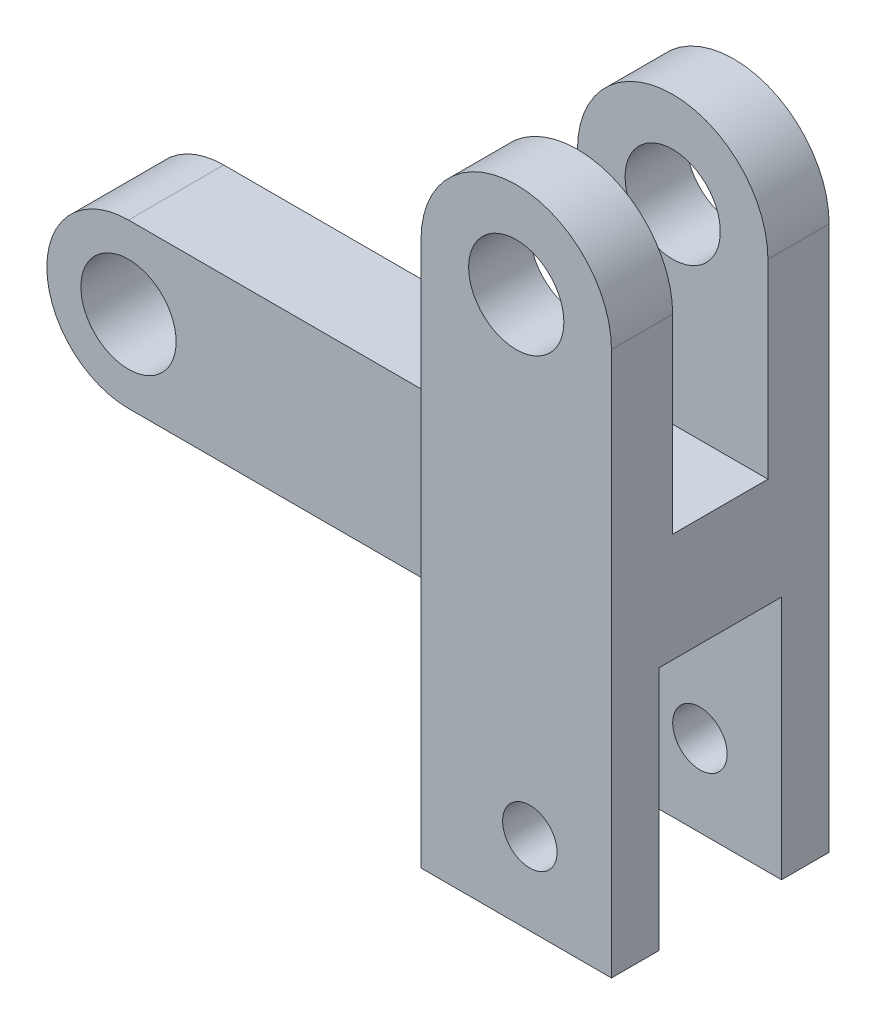
ISO-10303-21;
HEADER;
FILE_DESCRIPTION(('STEP AP214'),'2;1');
FILE_NAME('part.step','',(''),(''),'','','');
FILE_SCHEMA(('AUTOMOTIVE_DESIGN { 1 0 10303 214 1 1 1 1 }'));
ENDSEC;
DATA;
#1=APPLICATION_CONTEXT('core data for automotive mechanical design processes');
#2=APPLICATION_PROTOCOL_DEFINITION('international standard','automotive_design',2000,#1);
#3=PRODUCT_CONTEXT('',#1,'mechanical');
#4=PRODUCT('Part','Part','',(#3));
#5=PRODUCT_RELATED_PRODUCT_CATEGORY('part','',(#4));
#6=PRODUCT_DEFINITION_FORMATION('','',#4);
#7=PRODUCT_DEFINITION_CONTEXT('part definition',#1,'design');
#8=PRODUCT_DEFINITION('design','',#6,#7);
#9=PRODUCT_DEFINITION_SHAPE('','',#8);
#10=(LENGTH_UNIT() NAMED_UNIT(*) SI_UNIT(.MILLI.,.METRE.));
#11=(NAMED_UNIT(*) PLANE_ANGLE_UNIT() SI_UNIT($,.RADIAN.));
#12=(NAMED_UNIT(*) SI_UNIT($,.STERADIAN.) SOLID_ANGLE_UNIT());
#13=UNCERTAINTY_MEASURE_WITH_UNIT(LENGTH_MEASURE(1.E-05),#10,'distance_accuracy_value','');
#14=(GEOMETRIC_REPRESENTATION_CONTEXT(3) GLOBAL_UNCERTAINTY_ASSIGNED_CONTEXT((#13)) GLOBAL_UNIT_ASSIGNED_CONTEXT((#10,
#11,#12)) REPRESENTATION_CONTEXT('',''));
#15=CARTESIAN_POINT('',(0.,0.,0.));
#16=DIRECTION('',(0.,0.,1.));
#17=DIRECTION('',(1.,0.,0.));
#18=AXIS2_PLACEMENT_3D('',#15,#16,#17);
#19=CARTESIAN_POINT('',(0.,2.4,-3.5));
#20=DIRECTION('',(1.,0.,0.));
#21=DIRECTION('',(0.,0.,-1.));
#22=AXIS2_PLACEMENT_3D('',#19,#20,#21);
#23=PLANE('',#22);
#24=DIRECTION('',(0.,-1.,0.));
#25=VECTOR('',#24,1.);
#26=CARTESIAN_POINT('',(0.,-0.999999999999999,2.25));
#27=LINE('',#26,#25);
#28=CARTESIAN_POINT('',(0.,-0.999999999999999,2.25));
#29=VERTEX_POINT('',#28);
#30=CARTESIAN_POINT('',(0.,-10.,2.25));
#31=VERTEX_POINT('',#30);
#32=EDGE_CURVE('E239',#29,#31,#27,.T.);
#33=ORIENTED_EDGE('',*,*,#32,.T.);
#34=DIRECTION('',(0.,0.,-1.));
#35=VECTOR('',#34,1.);
#36=CARTESIAN_POINT('',(0.,-10.,3.5));
#37=LINE('',#36,#35);
#38=CARTESIAN_POINT('',(0.,-10.,4.));
#39=VERTEX_POINT('',#38);
#40=EDGE_CURVE('E278',#39,#31,#37,.T.);
#41=ORIENTED_EDGE('',*,*,#40,.F.);
#42=DIRECTION('',(0.,-1.,0.));
#43=VECTOR('',#42,1.);
#44=CARTESIAN_POINT('',(0.,10.,4.));
#45=LINE('',#44,#43);
#46=CARTESIAN_POINT('',(0.,10.,4.));
#47=VERTEX_POINT('',#46);
#48=EDGE_CURVE('E212',#47,#39,#45,.T.);
#49=ORIENTED_EDGE('',*,*,#48,.F.);
#50=DIRECTION('',(0.,0.,1.));
#51=VECTOR('',#50,1.);
#52=CARTESIAN_POINT('',(0.,10.,1.75));
#53=LINE('',#52,#51);
#54=CARTESIAN_POINT('',(0.,10.,1.75));
#55=VERTEX_POINT('',#54);
#56=EDGE_CURVE('E296',#55,#47,#53,.T.);
#57=ORIENTED_EDGE('',*,*,#56,.F.);
#58=DIRECTION('',(0.,1.,0.));
#59=VECTOR('',#58,1.);
#60=CARTESIAN_POINT('',(0.,0.,1.75));
#61=LINE('',#60,#59);
#62=CARTESIAN_POINT('',(0.,3.,1.75));
#63=VERTEX_POINT('',#62);
#64=EDGE_CURVE('E285',#63,#55,#61,.T.);
#65=ORIENTED_EDGE('',*,*,#64,.F.);
#66=CARTESIAN_POINT('',(0.,-0.999999999999999,1.75));
#67=VERTEX_POINT('',#66);
#68=EDGE_CURVE('E290',#67,#63,#61,.T.);
#69=ORIENTED_EDGE('',*,*,#68,.F.);
#70=DIRECTION('',(0.,0.,1.));
#71=VECTOR('',#70,1.);
#72=CARTESIAN_POINT('',(0.,-0.999999999999999,2.25));
#73=LINE('',#72,#71);
#74=EDGE_CURVE('E221',#67,#29,#73,.T.);
#75=ORIENTED_EDGE('',*,*,#74,.T.);
#76=EDGE_LOOP('',(#33,#41,#49,#57,#65,#69,#75));
#77=FACE_BOUND('',#76,.T.);
#78=ADVANCED_FACE('F45',(#77),#23,.F.);
#79=DIRECTION('',(0.,-1.,0.));
#80=VECTOR('',#79,1.);
#81=CARTESIAN_POINT('',(0.,-0.999999999999999,-2.25));
#82=LINE('',#81,#80);
#83=CARTESIAN_POINT('',(0.,-0.999999999999999,-2.25));
#84=VERTEX_POINT('',#83);
#85=CARTESIAN_POINT('',(0.,-10.,-2.25));
#86=VERTEX_POINT('',#85);
#87=EDGE_CURVE('E228',#84,#86,#82,.T.);
#88=ORIENTED_EDGE('',*,*,#87,.F.);
#89=CARTESIAN_POINT('',(0.,-0.999999999999999,-1.75));
#90=VERTEX_POINT('',#89);
#91=EDGE_CURVE('E216',#84,#90,#73,.T.);
#92=ORIENTED_EDGE('',*,*,#91,.T.);
#93=DIRECTION('',(0.,1.,0.));
#94=VECTOR('',#93,1.);
#95=CARTESIAN_POINT('',(0.,0.,-1.75));
#96=LINE('',#95,#94);
#97=CARTESIAN_POINT('',(0.,3.,-1.75));
#98=VERTEX_POINT('',#97);
#99=EDGE_CURVE('E301',#90,#98,#96,.T.);
#100=ORIENTED_EDGE('',*,*,#99,.T.);
#101=CARTESIAN_POINT('',(0.,10.,-1.75));
#102=VERTEX_POINT('',#101);
#103=EDGE_CURVE('E298',#98,#102,#96,.T.);
#104=ORIENTED_EDGE('',*,*,#103,.T.);
#105=DIRECTION('',(0.,0.,-1.));
#106=VECTOR('',#105,1.);
#107=CARTESIAN_POINT('',(0.,10.,-1.75));
#108=LINE('',#107,#106);
#109=CARTESIAN_POINT('',(0.,10.,-4.));
#110=VERTEX_POINT('',#109);
#111=EDGE_CURVE('E169',#102,#110,#108,.T.);
#112=ORIENTED_EDGE('',*,*,#111,.T.);
#113=DIRECTION('',(0.,1.,0.));
#114=VECTOR('',#113,1.);
#115=CARTESIAN_POINT('',(0.,-10.,-4.));
#116=LINE('',#115,#114);
#117=CARTESIAN_POINT('',(0.,-10.,-4.));
#118=VERTEX_POINT('',#117);
#119=EDGE_CURVE('E187',#118,#110,#116,.T.);
#120=ORIENTED_EDGE('',*,*,#119,.F.);
#121=EDGE_CURVE('E277',#86,#118,#37,.T.);
#122=ORIENTED_EDGE('',*,*,#121,.F.);
#123=EDGE_LOOP('',(#88,#92,#100,#104,#112,#120,#122));
#124=FACE_BOUND('',#123,.T.);
#125=ADVANCED_FACE('F368',(#124),#23,.F.);
#126=CARTESIAN_POINT('',(7.,2.4,-3.5));
#127=DIRECTION('',(-1.,0.,0.));
#128=DIRECTION('',(0.,0.,1.));
#129=AXIS2_PLACEMENT_3D('',#126,#127,#128);
#130=PLANE('',#129);
#131=DIRECTION('',(0.,-1.,0.));
#132=VECTOR('',#131,1.);
#133=CARTESIAN_POINT('',(7.,-0.999999999999999,2.25));
#134=LINE('',#133,#132);
#135=CARTESIAN_POINT('',(7.,-0.999999999999999,2.25));
#136=VERTEX_POINT('',#135);
#137=CARTESIAN_POINT('',(7.,-10.,2.25));
#138=VERTEX_POINT('',#137);
#139=EDGE_CURVE('E237',#136,#138,#134,.T.);
#140=ORIENTED_EDGE('',*,*,#139,.F.);
#141=DIRECTION('',(0.,0.,-1.));
#142=VECTOR('',#141,1.);
#143=CARTESIAN_POINT('',(7.,-0.999999999999999,2.25));
#144=LINE('',#143,#142);
#145=CARTESIAN_POINT('',(7.,-0.999999999999999,-2.25));
#146=VERTEX_POINT('',#145);
#147=EDGE_CURVE('E223',#136,#146,#144,.T.);
#148=ORIENTED_EDGE('',*,*,#147,.T.);
#149=DIRECTION('',(0.,-1.,0.));
#150=VECTOR('',#149,1.);
#151=CARTESIAN_POINT('',(7.,-0.999999999999999,-2.25));
#152=LINE('',#151,#150);
#153=CARTESIAN_POINT('',(7.,-10.,-2.25));
#154=VERTEX_POINT('',#153);
#155=EDGE_CURVE('E235',#146,#154,#152,.T.);
#156=ORIENTED_EDGE('',*,*,#155,.T.);
#157=DIRECTION('',(0.,0.,1.));
#158=VECTOR('',#157,1.);
#159=CARTESIAN_POINT('',(7.,-10.,-3.5));
#160=LINE('',#159,#158);
#161=CARTESIAN_POINT('',(7.,-10.,-4.));
#162=VERTEX_POINT('',#161);
#163=EDGE_CURVE('E177',#162,#154,#160,.T.);
#164=ORIENTED_EDGE('',*,*,#163,.F.);
#165=DIRECTION('',(0.,-1.,0.));
#166=VECTOR('',#165,1.);
#167=CARTESIAN_POINT('',(7.,10.,-4.));
#168=LINE('',#167,#166);
#169=CARTESIAN_POINT('',(7.,10.,-4.));
#170=VERTEX_POINT('',#169);
#171=EDGE_CURVE('E172',#170,#162,#168,.T.);
#172=ORIENTED_EDGE('',*,*,#171,.F.);
#173=DIRECTION('',(0.,0.,-1.));
#174=VECTOR('',#173,1.);
#175=CARTESIAN_POINT('',(7.,10.,-1.75));
#176=LINE('',#175,#174);
#177=CARTESIAN_POINT('',(7.,10.,-1.75));
#178=VERTEX_POINT('',#177);
#179=EDGE_CURVE('E53',#178,#170,#176,.T.);
#180=ORIENTED_EDGE('',*,*,#179,.F.);
#181=DIRECTION('',(0.,-1.,0.));
#182=VECTOR('',#181,1.);
#183=CARTESIAN_POINT('',(7.,0.,-1.75));
#184=LINE('',#183,#182);
#185=CARTESIAN_POINT('',(7.,3.,-1.75));
#186=VERTEX_POINT('',#185);
#187=EDGE_CURVE('E303',#178,#186,#184,.T.);
#188=ORIENTED_EDGE('',*,*,#187,.T.);
#189=DIRECTION('',(0.,0.,-1.));
#190=VECTOR('',#189,1.);
#191=CARTESIAN_POINT('',(7.,3.,1.75));
#192=LINE('',#191,#190);
#193=CARTESIAN_POINT('',(7.,3.,1.75));
#194=VERTEX_POINT('',#193);
#195=EDGE_CURVE('E269',#194,#186,#192,.T.);
#196=ORIENTED_EDGE('',*,*,#195,.F.);
#197=DIRECTION('',(0.,-1.,0.));
#198=VECTOR('',#197,1.);
#199=CARTESIAN_POINT('',(7.,0.,1.75));
#200=LINE('',#199,#198);
#201=CARTESIAN_POINT('',(7.,10.,1.75));
#202=VERTEX_POINT('',#201);
#203=EDGE_CURVE('E292',#202,#194,#200,.T.);
#204=ORIENTED_EDGE('',*,*,#203,.F.);
#205=DIRECTION('',(0.,0.,1.));
#206=VECTOR('',#205,1.);
#207=CARTESIAN_POINT('',(7.,10.,1.75));
#208=LINE('',#207,#206);
#209=CARTESIAN_POINT('',(7.,10.,4.));
#210=VERTEX_POINT('',#209);
#211=EDGE_CURVE('E294',#202,#210,#208,.T.);
#212=ORIENTED_EDGE('',*,*,#211,.T.);
#213=DIRECTION('',(0.,1.,0.));
#214=VECTOR('',#213,1.);
#215=CARTESIAN_POINT('',(7.,-10.,4.));
#216=LINE('',#215,#214);
#217=CARTESIAN_POINT('',(7.,-10.,4.));
#218=VERTEX_POINT('',#217);
#219=EDGE_CURVE('E206',#218,#210,#216,.T.);
#220=ORIENTED_EDGE('',*,*,#219,.F.);
#221=EDGE_CURVE('E275',#138,#218,#160,.T.);
#222=ORIENTED_EDGE('',*,*,#221,.F.);
#223=EDGE_LOOP('',(#140,#148,#156,#164,#172,#180,#188,#196,#204,#212,#220,#222));
#224=FACE_BOUND('',#223,.T.);
#225=ADVANCED_FACE('F174',(#224),#130,.F.);
#226=CARTESIAN_POINT('',(0.,-10.,0.));
#227=DIRECTION('',(0.,-1.,0.));
#228=DIRECTION('',(0.,0.,-1.));
#229=AXIS2_PLACEMENT_3D('',#226,#227,#228);
#230=PLANE('',#229);
#231=ORIENTED_EDGE('',*,*,#40,.T.);
#232=DIRECTION('',(1.,0.,0.));
#233=VECTOR('',#232,1.);
#234=CARTESIAN_POINT('',(0.,-10.,2.25));
#235=LINE('',#234,#233);
#236=EDGE_CURVE('E215',#31,#138,#235,.T.);
#237=ORIENTED_EDGE('',*,*,#236,.T.);
#238=ORIENTED_EDGE('',*,*,#221,.T.);
#239=DIRECTION('',(1.,0.,0.));
#240=VECTOR('',#239,1.);
#241=CARTESIAN_POINT('',(0.,-10.,4.));
#242=LINE('',#241,#240);
#243=EDGE_CURVE('E203',#39,#218,#242,.T.);
#244=ORIENTED_EDGE('',*,*,#243,.F.);
#245=EDGE_LOOP('',(#231,#237,#238,#244));
#246=FACE_BOUND('',#245,.T.);
#247=ADVANCED_FACE('F330',(#246),#230,.T.);
#248=ORIENTED_EDGE('',*,*,#163,.T.);
#249=DIRECTION('',(-1.,0.,0.));
#250=VECTOR('',#249,1.);
#251=CARTESIAN_POINT('',(0.,-10.,-2.25));
#252=LINE('',#251,#250);
#253=EDGE_CURVE('E231',#154,#86,#252,.T.);
#254=ORIENTED_EDGE('',*,*,#253,.T.);
#255=ORIENTED_EDGE('',*,*,#121,.T.);
#256=DIRECTION('',(-1.,0.,0.));
#257=VECTOR('',#256,1.);
#258=CARTESIAN_POINT('',(7.,-10.,-4.));
#259=LINE('',#258,#257);
#260=EDGE_CURVE('E181',#162,#118,#259,.T.);
#261=ORIENTED_EDGE('',*,*,#260,.F.);
#262=EDGE_LOOP('',(#248,#254,#255,#261));
#263=FACE_BOUND('',#262,.T.);
#264=ADVANCED_FACE('F379',(#263),#230,.T.);
#265=CARTESIAN_POINT('',(4.,-7.,-3.5));
#266=DIRECTION('',(0.,0.,1.));
#267=DIRECTION('',(1.,0.,0.));
#268=AXIS2_PLACEMENT_3D('',#265,#266,#267);
#269=CYLINDRICAL_SURFACE('',#268,1.);
#270=CARTESIAN_POINT('',(4.,-7.,2.25));
#271=DIRECTION('',(0.,0.,-1.));
#272=DIRECTION('',(-1.,0.,0.));
#273=AXIS2_PLACEMENT_3D('',#270,#271,#272);
#274=CIRCLE('',#273,1.);
#275=CARTESIAN_POINT('',(3.,-7.,2.25));
#276=VERTEX_POINT('',#275);
#277=EDGE_CURVE('E48',#276,#276,#274,.T.);
#278=ORIENTED_EDGE('',*,*,#277,.T.);
#279=EDGE_LOOP('',(#278));
#280=FACE_BOUND('',#279,.T.);
#281=CARTESIAN_POINT('',(4.,-7.,4.));
#282=DIRECTION('',(0.,0.,1.));
#283=DIRECTION('',(1.,0.,0.));
#284=AXIS2_PLACEMENT_3D('',#281,#282,#283);
#285=CIRCLE('',#284,1.);
#286=CARTESIAN_POINT('',(5.,-7.,4.));
#287=VERTEX_POINT('',#286);
#288=EDGE_CURVE('E200',#287,#287,#285,.T.);
#289=ORIENTED_EDGE('',*,*,#288,.T.);
#290=EDGE_LOOP('',(#289));
#291=FACE_BOUND('',#290,.T.);
#292=ADVANCED_FACE('F313',(#280,#291),#269,.F.);
#293=CARTESIAN_POINT('',(4.,-7.,-2.25));
#294=DIRECTION('',(0.,0.,1.));
#295=DIRECTION('',(1.,0.,0.));
#296=AXIS2_PLACEMENT_3D('',#293,#294,#295);
#297=CIRCLE('',#296,1.);
#298=CARTESIAN_POINT('',(5.,-7.,-2.25));
#299=VERTEX_POINT('',#298);
#300=EDGE_CURVE('E242',#299,#299,#297,.T.);
#301=ORIENTED_EDGE('',*,*,#300,.T.);
#302=EDGE_LOOP('',(#301));
#303=FACE_BOUND('',#302,.T.);
#304=CARTESIAN_POINT('',(4.,-7.,-4.));
#305=DIRECTION('',(0.,0.,-1.));
#306=DIRECTION('',(-1.,0.,0.));
#307=AXIS2_PLACEMENT_3D('',#304,#305,#306);
#308=CIRCLE('',#307,0.999999999999997);
#309=CARTESIAN_POINT('',(3.,-7.,-4.));
#310=VERTEX_POINT('',#309);
#311=EDGE_CURVE('E188',#310,#310,#308,.T.);
#312=ORIENTED_EDGE('',*,*,#311,.T.);
#313=EDGE_LOOP('',(#312));
#314=FACE_BOUND('',#313,.T.);
#315=ADVANCED_FACE('F387',(#303,#314),#269,.F.);
#316=CARTESIAN_POINT('',(3.5,10.,-1.75));
#317=DIRECTION('',(0.,0.,-1.));
#318=DIRECTION('',(-1.,0.,0.));
#319=AXIS2_PLACEMENT_3D('',#316,#317,#318);
#320=CYLINDRICAL_SURFACE('',#319,3.5);
#321=ORIENTED_EDGE('',*,*,#179,.T.);
#322=CARTESIAN_POINT('',(3.5,10.,-4.));
#323=DIRECTION('',(0.,0.,-1.));
#324=DIRECTION('',(-1.,0.,0.));
#325=AXIS2_PLACEMENT_3D('',#322,#323,#324);
#326=CIRCLE('',#325,3.5);
#327=EDGE_CURVE('E165',#110,#170,#326,.T.);
#328=ORIENTED_EDGE('',*,*,#327,.F.);
#329=ORIENTED_EDGE('',*,*,#111,.F.);
#330=CARTESIAN_POINT('',(3.5,10.,-1.75));
#331=DIRECTION('',(0.,0.,-1.));
#332=DIRECTION('',(-1.,0.,0.));
#333=AXIS2_PLACEMENT_3D('',#330,#331,#332);
#334=CIRCLE('',#333,3.5);
#335=EDGE_CURVE('E167',#102,#178,#334,.T.);
#336=ORIENTED_EDGE('',*,*,#335,.T.);
#337=EDGE_LOOP('',(#321,#328,#329,#336));
#338=FACE_BOUND('',#337,.T.);
#339=ADVANCED_FACE('F162',(#338),#320,.T.);
#340=CARTESIAN_POINT('',(0.,0.,-1.75));
#341=DIRECTION('',(0.,0.,-1.));
#342=DIRECTION('',(-1.,0.,0.));
#343=AXIS2_PLACEMENT_3D('',#340,#341,#342);
#344=PLANE('',#343);
#345=CARTESIAN_POINT('',(3.5,10.,-1.75));
#346=DIRECTION('',(0.,0.,-1.));
#347=DIRECTION('',(-1.,0.,0.));
#348=AXIS2_PLACEMENT_3D('',#345,#346,#347);
#349=CIRCLE('',#348,1.75);
#350=CARTESIAN_POINT('',(1.75,10.,-1.75));
#351=VERTEX_POINT('',#350);
#352=EDGE_CURVE('E282',#351,#351,#349,.T.);
#353=ORIENTED_EDGE('',*,*,#352,.T.);
#354=EDGE_LOOP('',(#353));
#355=FACE_BOUND('',#354,.T.);
#356=ORIENTED_EDGE('',*,*,#103,.F.);
#357=DIRECTION('',(1.,0.,0.));
#358=VECTOR('',#357,1.);
#359=CARTESIAN_POINT('',(0.,3.,-1.75));
#360=LINE('',#359,#358);
#361=EDGE_CURVE('E69',#98,#186,#360,.T.);
#362=ORIENTED_EDGE('',*,*,#361,.T.);
#363=ORIENTED_EDGE('',*,*,#187,.F.);
#364=ORIENTED_EDGE('',*,*,#335,.F.);
#365=EDGE_LOOP('',(#356,#362,#363,#364));
#366=FACE_BOUND('',#365,.T.);
#367=ADVANCED_FACE('F369',(#355,#366),#344,.F.);
#368=CARTESIAN_POINT('',(3.5,10.,1.75));
#369=DIRECTION('',(0.,0.,1.));
#370=DIRECTION('',(1.,0.,0.));
#371=AXIS2_PLACEMENT_3D('',#368,#369,#370);
#372=CYLINDRICAL_SURFACE('',#371,3.5);
#373=ORIENTED_EDGE('',*,*,#56,.T.);
#374=CARTESIAN_POINT('',(3.5,10.,4.));
#375=DIRECTION('',(0.,0.,1.));
#376=DIRECTION('',(1.,0.,0.));
#377=AXIS2_PLACEMENT_3D('',#374,#375,#376);
#378=CIRCLE('',#377,3.5);
#379=EDGE_CURVE('E209',#210,#47,#378,.T.);
#380=ORIENTED_EDGE('',*,*,#379,.F.);
#381=ORIENTED_EDGE('',*,*,#211,.F.);
#382=CARTESIAN_POINT('',(3.5,10.,1.75));
#383=DIRECTION('',(0.,0.,-1.));
#384=DIRECTION('',(-1.,0.,0.));
#385=AXIS2_PLACEMENT_3D('',#382,#383,#384);
#386=CIRCLE('',#385,3.5);
#387=EDGE_CURVE('E289',#55,#202,#386,.T.);
#388=ORIENTED_EDGE('',*,*,#387,.F.);
#389=EDGE_LOOP('',(#373,#380,#381,#388));
#390=FACE_BOUND('',#389,.T.);
#391=ADVANCED_FACE('F340',(#390),#372,.T.);
#392=CARTESIAN_POINT('',(0.,0.,1.75));
#393=DIRECTION('',(0.,0.,-1.));
#394=DIRECTION('',(-1.,0.,0.));
#395=AXIS2_PLACEMENT_3D('',#392,#393,#394);
#396=PLANE('',#395);
#397=DIRECTION('',(1.,0.,0.));
#398=VECTOR('',#397,1.);
#399=CARTESIAN_POINT('',(0.,3.,1.75));
#400=LINE('',#399,#398);
#401=EDGE_CURVE('E12',#63,#194,#400,.T.);
#402=ORIENTED_EDGE('',*,*,#401,.F.);
#403=ORIENTED_EDGE('',*,*,#64,.T.);
#404=ORIENTED_EDGE('',*,*,#387,.T.);
#405=ORIENTED_EDGE('',*,*,#203,.T.);
#406=EDGE_LOOP('',(#402,#403,#404,#405));
#407=FACE_BOUND('',#406,.T.);
#408=CARTESIAN_POINT('',(3.5,10.,1.75));
#409=DIRECTION('',(0.,0.,-1.));
#410=DIRECTION('',(-1.,0.,0.));
#411=AXIS2_PLACEMENT_3D('',#408,#409,#410);
#412=CIRCLE('',#411,1.75);
#413=CARTESIAN_POINT('',(1.75,10.,1.75));
#414=VERTEX_POINT('',#413);
#415=EDGE_CURVE('E281',#414,#414,#412,.T.);
#416=ORIENTED_EDGE('',*,*,#415,.F.);
#417=EDGE_LOOP('',(#416));
#418=FACE_BOUND('',#417,.T.);
#419=ADVANCED_FACE('F345',(#407,#418),#396,.T.);
#420=CARTESIAN_POINT('',(3.5,10.,3.5));
#421=DIRECTION('',(0.,0.,-1.));
#422=DIRECTION('',(-1.,0.,0.));
#423=AXIS2_PLACEMENT_3D('',#420,#421,#422);
#424=CYLINDRICAL_SURFACE('',#423,1.75);
#425=ORIENTED_EDGE('',*,*,#415,.T.);
#426=EDGE_LOOP('',(#425));
#427=FACE_BOUND('',#426,.T.);
#428=CARTESIAN_POINT('',(3.5,10.,4.));
#429=DIRECTION('',(0.,0.,1.));
#430=DIRECTION('',(1.,0.,0.));
#431=AXIS2_PLACEMENT_3D('',#428,#429,#430);
#432=CIRCLE('',#431,1.75);
#433=CARTESIAN_POINT('',(5.25,10.,4.));
#434=VERTEX_POINT('',#433);
#435=EDGE_CURVE('E197',#434,#434,#432,.T.);
#436=ORIENTED_EDGE('',*,*,#435,.T.);
#437=EDGE_LOOP('',(#436));
#438=FACE_BOUND('',#437,.T.);
#439=ADVANCED_FACE('F411',(#427,#438),#424,.F.);
#440=ORIENTED_EDGE('',*,*,#352,.F.);
#441=EDGE_LOOP('',(#440));
#442=FACE_BOUND('',#441,.T.);
#443=CARTESIAN_POINT('',(3.5,10.,-4.));
#444=DIRECTION('',(0.,0.,-1.));
#445=DIRECTION('',(-1.,0.,0.));
#446=AXIS2_PLACEMENT_3D('',#443,#444,#445);
#447=CIRCLE('',#446,1.75);
#448=CARTESIAN_POINT('',(1.75,10.,-4.));
#449=VERTEX_POINT('',#448);
#450=EDGE_CURVE('E191',#449,#449,#447,.T.);
#451=ORIENTED_EDGE('',*,*,#450,.T.);
#452=EDGE_LOOP('',(#451));
#453=FACE_BOUND('',#452,.T.);
#454=ADVANCED_FACE('F413',(#442,#453),#424,.F.);
#455=CARTESIAN_POINT('',(0.,-3.,1.75));
#456=DIRECTION('',(0.,1.,0.));
#457=DIRECTION('',(-1.,0.,0.));
#458=AXIS2_PLACEMENT_3D('',#455,#456,#457);
#459=PLANE('',#458);
#460=DIRECTION('',(1.,0.,0.));
#461=VECTOR('',#460,1.);
#462=CARTESIAN_POINT('',(0.,-3.,-1.75));
#463=LINE('',#462,#461);
#464=CARTESIAN_POINT('',(-13.,-3.,-1.75));
#465=VERTEX_POINT('',#464);
#466=CARTESIAN_POINT('',(0.,-3.,-1.75));
#467=VERTEX_POINT('',#466);
#468=EDGE_CURVE('E263',#465,#467,#463,.T.);
#469=ORIENTED_EDGE('',*,*,#468,.T.);
#470=DIRECTION('',(0.,0.,1.));
#471=VECTOR('',#470,1.);
#472=CARTESIAN_POINT('',(0.,-3.,-3.5));
#473=LINE('',#472,#471);
#474=CARTESIAN_POINT('',(0.,-3.,1.75));
#475=VERTEX_POINT('',#474);
#476=EDGE_CURVE('E61',#467,#475,#473,.T.);
#477=ORIENTED_EDGE('',*,*,#476,.T.);
#478=DIRECTION('',(1.,0.,0.));
#479=VECTOR('',#478,1.);
#480=CARTESIAN_POINT('',(0.,-3.,1.75));
#481=LINE('',#480,#479);
#482=CARTESIAN_POINT('',(-13.,-3.,1.75));
#483=VERTEX_POINT('',#482);
#484=EDGE_CURVE('E250',#483,#475,#481,.T.);
#485=ORIENTED_EDGE('',*,*,#484,.F.);
#486=DIRECTION('',(0.,0.,-1.));
#487=VECTOR('',#486,1.);
#488=CARTESIAN_POINT('',(-13.,-3.,1.75));
#489=LINE('',#488,#487);
#490=EDGE_CURVE('E272',#483,#465,#489,.T.);
#491=ORIENTED_EDGE('',*,*,#490,.T.);
#492=EDGE_LOOP('',(#469,#477,#485,#491));
#493=FACE_BOUND('',#492,.T.);
#494=ADVANCED_FACE('F355',(#493),#459,.F.);
#495=CARTESIAN_POINT('',(0.,0.,1.75));
#496=DIRECTION('',(0.,0.,1.));
#497=DIRECTION('',(1.,0.,0.));
#498=AXIS2_PLACEMENT_3D('',#495,#496,#497);
#499=PLANE('',#498);
#500=CARTESIAN_POINT('',(-13.,0.,1.75));
#501=DIRECTION('',(0.,0.,1.));
#502=DIRECTION('',(1.,0.,0.));
#503=AXIS2_PLACEMENT_3D('',#500,#501,#502);
#504=CIRCLE('',#503,1.75);
#505=CARTESIAN_POINT('',(-11.25,0.,1.75));
#506=VERTEX_POINT('',#505);
#507=EDGE_CURVE('E243',#506,#506,#504,.T.);
#508=ORIENTED_EDGE('',*,*,#507,.F.);
#509=EDGE_LOOP('',(#508));
#510=FACE_BOUND('',#509,.T.);
#511=EDGE_CURVE('E286',#475,#67,#61,.T.);
#512=ORIENTED_EDGE('',*,*,#511,.T.);
#513=ORIENTED_EDGE('',*,*,#68,.T.);
#514=DIRECTION('',(1.,0.,0.));
#515=VECTOR('',#514,1.);
#516=CARTESIAN_POINT('',(0.,3.,1.75));
#517=LINE('',#516,#515);
#518=CARTESIAN_POINT('',(-13.,3.,1.75));
#519=VERTEX_POINT('',#518);
#520=EDGE_CURVE('E253',#519,#63,#517,.T.);
#521=ORIENTED_EDGE('',*,*,#520,.F.);
#522=CARTESIAN_POINT('',(-13.,0.,1.75));
#523=DIRECTION('',(0.,0.,1.));
#524=DIRECTION('',(1.,0.,0.));
#525=AXIS2_PLACEMENT_3D('',#522,#523,#524);
#526=CIRCLE('',#525,3.);
#527=EDGE_CURVE('E246',#483,#519,#526,.F.);
#528=ORIENTED_EDGE('',*,*,#527,.F.);
#529=ORIENTED_EDGE('',*,*,#484,.T.);
#530=EDGE_LOOP('',(#512,#513,#521,#528,#529));
#531=FACE_BOUND('',#530,.T.);
#532=ADVANCED_FACE('F349',(#510,#531),#499,.T.);
#533=CARTESIAN_POINT('',(0.,0.,-1.75));
#534=DIRECTION('',(0.,0.,1.));
#535=DIRECTION('',(1.,0.,0.));
#536=AXIS2_PLACEMENT_3D('',#533,#534,#535);
#537=PLANE('',#536);
#538=CARTESIAN_POINT('',(-13.,0.,-1.75));
#539=DIRECTION('',(0.,0.,1.));
#540=DIRECTION('',(1.,0.,0.));
#541=AXIS2_PLACEMENT_3D('',#538,#539,#540);
#542=CIRCLE('',#541,1.75);
#543=CARTESIAN_POINT('',(-11.25,0.,-1.75));
#544=VERTEX_POINT('',#543);
#545=EDGE_CURVE('E257',#544,#544,#542,.T.);
#546=ORIENTED_EDGE('',*,*,#545,.T.);
#547=EDGE_LOOP('',(#546));
#548=FACE_BOUND('',#547,.T.);
#549=CARTESIAN_POINT('',(-13.,3.,-1.75));
#550=VERTEX_POINT('',#549);
#551=EDGE_CURVE('E247',#550,#98,#360,.T.);
#552=ORIENTED_EDGE('',*,*,#551,.T.);
#553=ORIENTED_EDGE('',*,*,#99,.F.);
#554=EDGE_CURVE('E299',#467,#90,#96,.T.);
#555=ORIENTED_EDGE('',*,*,#554,.F.);
#556=ORIENTED_EDGE('',*,*,#468,.F.);
#557=CARTESIAN_POINT('',(-13.,0.,-1.75));
#558=DIRECTION('',(0.,0.,1.));
#559=DIRECTION('',(1.,0.,0.));
#560=AXIS2_PLACEMENT_3D('',#557,#558,#559);
#561=CIRCLE('',#560,3.);
#562=EDGE_CURVE('E260',#465,#550,#561,.F.);
#563=ORIENTED_EDGE('',*,*,#562,.T.);
#564=EDGE_LOOP('',(#552,#553,#555,#556,#563));
#565=FACE_BOUND('',#564,.T.);
#566=ADVANCED_FACE('F359',(#548,#565),#537,.F.);
#567=CARTESIAN_POINT('',(-13.,0.,1.75));
#568=DIRECTION('',(0.,0.,-1.));
#569=DIRECTION('',(-1.,0.,0.));
#570=AXIS2_PLACEMENT_3D('',#567,#568,#569);
#571=CYLINDRICAL_SURFACE('',#570,3.);
#572=ORIENTED_EDGE('',*,*,#562,.F.);
#573=ORIENTED_EDGE('',*,*,#490,.F.);
#574=ORIENTED_EDGE('',*,*,#527,.T.);
#575=DIRECTION('',(0.,0.,-1.));
#576=VECTOR('',#575,1.);
#577=CARTESIAN_POINT('',(-13.,3.,1.75));
#578=LINE('',#577,#576);
#579=EDGE_CURVE('E256',#519,#550,#578,.T.);
#580=ORIENTED_EDGE('',*,*,#579,.T.);
#581=EDGE_LOOP('',(#572,#573,#574,#580));
#582=FACE_BOUND('',#581,.T.);
#583=ADVANCED_FACE('F363',(#582),#571,.T.);
#584=CARTESIAN_POINT('',(-13.,0.,1.75));
#585=DIRECTION('',(0.,0.,-1.));
#586=DIRECTION('',(-1.,0.,0.));
#587=AXIS2_PLACEMENT_3D('',#584,#585,#586);
#588=CYLINDRICAL_SURFACE('',#587,1.75);
#589=ORIENTED_EDGE('',*,*,#507,.T.);
#590=EDGE_LOOP('',(#589));
#591=FACE_BOUND('',#590,.T.);
#592=ORIENTED_EDGE('',*,*,#545,.F.);
#593=EDGE_LOOP('',(#592));
#594=FACE_BOUND('',#593,.T.);
#595=ADVANCED_FACE('F445',(#591,#594),#588,.F.);
#596=CARTESIAN_POINT('',(0.,3.,1.75));
#597=DIRECTION('',(0.,1.,0.));
#598=DIRECTION('',(0.,0.,1.));
#599=AXIS2_PLACEMENT_3D('',#596,#597,#598);
#600=PLANE('',#599);
#601=ORIENTED_EDGE('',*,*,#551,.F.);
#602=ORIENTED_EDGE('',*,*,#579,.F.);
#603=ORIENTED_EDGE('',*,*,#520,.T.);
#604=ORIENTED_EDGE('',*,*,#401,.T.);
#605=ORIENTED_EDGE('',*,*,#195,.T.);
#606=ORIENTED_EDGE('',*,*,#361,.F.);
#607=EDGE_LOOP('',(#601,#602,#603,#604,#605,#606));
#608=FACE_BOUND('',#607,.T.);
#609=ADVANCED_FACE('F365',(#608),#600,.T.);
#610=CARTESIAN_POINT('',(0.,-0.999999999999999,2.25));
#611=DIRECTION('',(1.,0.,0.));
#612=DIRECTION('',(0.,0.,-1.));
#613=AXIS2_PLACEMENT_3D('',#610,#611,#612);
#614=PLANE('',#613);
#615=ORIENTED_EDGE('',*,*,#476,.F.);
#616=ORIENTED_EDGE('',*,*,#554,.T.);
#617=EDGE_CURVE('E220',#90,#67,#73,.T.);
#618=ORIENTED_EDGE('',*,*,#617,.T.);
#619=ORIENTED_EDGE('',*,*,#511,.F.);
#620=EDGE_LOOP('',(#615,#616,#618,#619));
#621=FACE_BOUND('',#620,.T.);
#622=ADVANCED_FACE('F320',(#621),#614,.T.);
#623=CARTESIAN_POINT('',(0.,-0.999999999999999,2.25));
#624=DIRECTION('',(0.,0.,-1.));
#625=DIRECTION('',(-1.,0.,0.));
#626=AXIS2_PLACEMENT_3D('',#623,#624,#625);
#627=PLANE('',#626);
#628=ORIENTED_EDGE('',*,*,#277,.F.);
#629=EDGE_LOOP('',(#628));
#630=FACE_BOUND('',#629,.T.);
#631=ORIENTED_EDGE('',*,*,#236,.F.);
#632=ORIENTED_EDGE('',*,*,#32,.F.);
#633=DIRECTION('',(1.,0.,0.));
#634=VECTOR('',#633,1.);
#635=CARTESIAN_POINT('',(0.,-0.999999999999999,2.25));
#636=LINE('',#635,#634);
#637=EDGE_CURVE('E219',#29,#136,#636,.T.);
#638=ORIENTED_EDGE('',*,*,#637,.T.);
#639=ORIENTED_EDGE('',*,*,#139,.T.);
#640=EDGE_LOOP('',(#631,#632,#638,#639));
#641=FACE_BOUND('',#640,.T.);
#642=ADVANCED_FACE('F316',(#630,#641),#627,.T.);
#643=CARTESIAN_POINT('',(0.,-0.999999999999999,-2.25));
#644=DIRECTION('',(0.,0.,1.));
#645=DIRECTION('',(1.,0.,0.));
#646=AXIS2_PLACEMENT_3D('',#643,#644,#645);
#647=PLANE('',#646);
#648=ORIENTED_EDGE('',*,*,#300,.F.);
#649=EDGE_LOOP('',(#648));
#650=FACE_BOUND('',#649,.T.);
#651=ORIENTED_EDGE('',*,*,#253,.F.);
#652=ORIENTED_EDGE('',*,*,#155,.F.);
#653=DIRECTION('',(-1.,0.,0.));
#654=VECTOR('',#653,1.);
#655=CARTESIAN_POINT('',(0.,-0.999999999999999,-2.25));
#656=LINE('',#655,#654);
#657=EDGE_CURVE('E226',#146,#84,#656,.T.);
#658=ORIENTED_EDGE('',*,*,#657,.T.);
#659=ORIENTED_EDGE('',*,*,#87,.T.);
#660=EDGE_LOOP('',(#651,#652,#658,#659));
#661=FACE_BOUND('',#660,.T.);
#662=ADVANCED_FACE('F319',(#650,#661),#647,.T.);
#663=CARTESIAN_POINT('',(0.,-0.999999999999999,0.));
#664=DIRECTION('',(0.,-1.,0.));
#665=DIRECTION('',(0.,0.,-1.));
#666=AXIS2_PLACEMENT_3D('',#663,#664,#665);
#667=PLANE('',#666);
#668=ORIENTED_EDGE('',*,*,#91,.F.);
#669=ORIENTED_EDGE('',*,*,#657,.F.);
#670=ORIENTED_EDGE('',*,*,#147,.F.);
#671=ORIENTED_EDGE('',*,*,#637,.F.);
#672=ORIENTED_EDGE('',*,*,#74,.F.);
#673=ORIENTED_EDGE('',*,*,#617,.F.);
#674=EDGE_LOOP('',(#668,#669,#670,#671,#672,#673));
#675=FACE_BOUND('',#674,.T.);
#676=ADVANCED_FACE('F375',(#675),#667,.T.);
#677=CARTESIAN_POINT('',(3.5,10.,4.));
#678=DIRECTION('',(0.,0.,1.));
#679=DIRECTION('',(1.,0.,0.));
#680=AXIS2_PLACEMENT_3D('',#677,#678,#679);
#681=PLANE('',#680);
#682=ORIENTED_EDGE('',*,*,#288,.F.);
#683=EDGE_LOOP('',(#682));
#684=FACE_BOUND('',#683,.T.);
#685=ORIENTED_EDGE('',*,*,#243,.T.);
#686=ORIENTED_EDGE('',*,*,#219,.T.);
#687=ORIENTED_EDGE('',*,*,#379,.T.);
#688=ORIENTED_EDGE('',*,*,#48,.T.);
#689=EDGE_LOOP('',(#685,#686,#687,#688));
#690=FACE_BOUND('',#689,.T.);
#691=ORIENTED_EDGE('',*,*,#435,.F.);
#692=EDGE_LOOP('',(#691));
#693=FACE_BOUND('',#692,.T.);
#694=ADVANCED_FACE('F333',(#684,#690,#693),#681,.T.);
#695=CARTESIAN_POINT('',(3.5,10.,-4.));
#696=DIRECTION('',(0.,0.,-1.));
#697=DIRECTION('',(-1.,0.,0.));
#698=AXIS2_PLACEMENT_3D('',#695,#696,#697);
#699=PLANE('',#698);
#700=ORIENTED_EDGE('',*,*,#311,.F.);
#701=EDGE_LOOP('',(#700));
#702=FACE_BOUND('',#701,.T.);
#703=ORIENTED_EDGE('',*,*,#327,.T.);
#704=ORIENTED_EDGE('',*,*,#171,.T.);
#705=ORIENTED_EDGE('',*,*,#260,.T.);
#706=ORIENTED_EDGE('',*,*,#119,.T.);
#707=EDGE_LOOP('',(#703,#704,#705,#706));
#708=FACE_BOUND('',#707,.T.);
#709=ORIENTED_EDGE('',*,*,#450,.F.);
#710=EDGE_LOOP('',(#709));
#711=FACE_BOUND('',#710,.T.);
#712=ADVANCED_FACE('F184',(#702,#708,#711),#699,.T.);
#713=CLOSED_SHELL('',(#78,#125,#225,#247,#264,#292,#315,#339,#367,#391,#419,#439,#454,#494,#532,
#566,#583,#595,#609,#622,#642,#662,#676,#694,#712));
#714=MANIFOLD_SOLID_BREP('B2',#713);
#715=ADVANCED_BREP_SHAPE_REPRESENTATION('',(#18,#714),#14);
#716=SHAPE_DEFINITION_REPRESENTATION(#9,#715);
ENDSEC;
END-ISO-10303-21;
